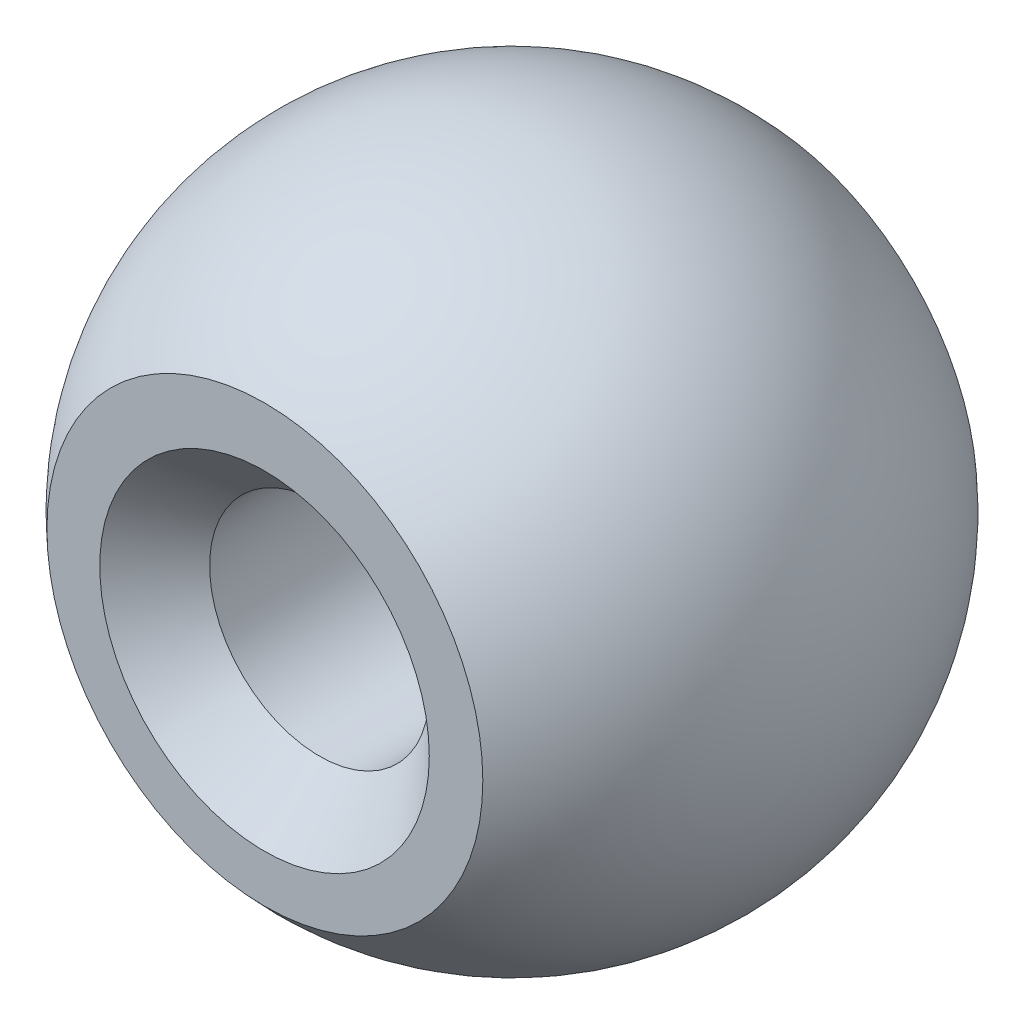
ISO-10303-21;
HEADER;
FILE_DESCRIPTION(('STEP AP214'),'2;1');
FILE_NAME('part.step','',(''),(''),'','','');
FILE_SCHEMA(('AUTOMOTIVE_DESIGN { 1 0 10303 214 1 1 1 1 }'));
ENDSEC;
DATA;
#1=APPLICATION_CONTEXT('core data for automotive mechanical design processes');
#2=APPLICATION_PROTOCOL_DEFINITION('international standard','automotive_design',2000,#1);
#3=PRODUCT_CONTEXT('',#1,'mechanical');
#4=PRODUCT('Part','Part','',(#3));
#5=PRODUCT_RELATED_PRODUCT_CATEGORY('part','',(#4));
#6=PRODUCT_DEFINITION_FORMATION('','',#4);
#7=PRODUCT_DEFINITION_CONTEXT('part definition',#1,'design');
#8=PRODUCT_DEFINITION('design','',#6,#7);
#9=PRODUCT_DEFINITION_SHAPE('','',#8);
#10=(LENGTH_UNIT() NAMED_UNIT(*) SI_UNIT(.MILLI.,.METRE.));
#11=(NAMED_UNIT(*) PLANE_ANGLE_UNIT() SI_UNIT($,.RADIAN.));
#12=(NAMED_UNIT(*) SI_UNIT($,.STERADIAN.) SOLID_ANGLE_UNIT());
#13=UNCERTAINTY_MEASURE_WITH_UNIT(LENGTH_MEASURE(1.E-05),#10,'distance_accuracy_value','');
#14=(GEOMETRIC_REPRESENTATION_CONTEXT(3) GLOBAL_UNCERTAINTY_ASSIGNED_CONTEXT((#13)) GLOBAL_UNIT_ASSIGNED_CONTEXT((#10,
#11,#12)) REPRESENTATION_CONTEXT('',''));
#15=CARTESIAN_POINT('',(0.,0.,0.));
#16=DIRECTION('',(0.,0.,1.));
#17=DIRECTION('',(1.,0.,0.));
#18=AXIS2_PLACEMENT_3D('',#15,#16,#17);
#19=CARTESIAN_POINT('',(0.,0.,4.5));
#20=DIRECTION('',(0.,0.,-1.));
#21=DIRECTION('',(-1.,0.,0.));
#22=AXIS2_PLACEMENT_3D('',#19,#20,#21);
#23=PLANE('',#22);
#24=CARTESIAN_POINT('',(-0.00600624762246791,-0.103314565755938,4.5));
#25=DIRECTION('',(0.,0.,1.));
#26=DIRECTION('',(1.,0.,0.));
#27=AXIS2_PLACEMENT_3D('',#24,#25,#26);
#28=CIRCLE('',#27,3.);
#29=CARTESIAN_POINT('',(2.99399375237753,-0.103314565755938,4.5));
#30=VERTEX_POINT('',#29);
#31=EDGE_CURVE('E54',#30,#30,#28,.T.);
#32=ORIENTED_EDGE('',*,*,#31,.F.);
#33=EDGE_LOOP('',(#32));
#34=FACE_BOUND('',#33,.T.);
#35=CARTESIAN_POINT('',(0.,0.,4.5));
#36=DIRECTION('',(0.,0.,-1.));
#37=DIRECTION('',(-1.,0.,0.));
#38=AXIS2_PLACEMENT_3D('',#35,#36,#37);
#39=CIRCLE('',#38,3.96862696659689);
#40=CARTESIAN_POINT('',(3.96862696659689,0.,4.5));
#41=VERTEX_POINT('',#40);
#42=EDGE_CURVE('E10',#41,#41,#39,.T.);
#43=ORIENTED_EDGE('',*,*,#42,.F.);
#44=EDGE_LOOP('',(#43));
#45=FACE_BOUND('',#44,.T.);
#46=ADVANCED_FACE('F35',(#34,#45),#23,.F.);
#47=CARTESIAN_POINT('',(0.,0.,0.));
#48=DIRECTION('',(0.,0.,-1.));
#49=DIRECTION('',(1.,0.,0.));
#50=AXIS2_PLACEMENT_3D('',#47,#48,#49);
#51=SPHERICAL_SURFACE('',#50,6.);
#52=CARTESIAN_POINT('',(0.,0.,-4.5));
#53=DIRECTION('',(0.,0.,-1.));
#54=DIRECTION('',(-1.,0.,0.));
#55=AXIS2_PLACEMENT_3D('',#52,#53,#54);
#56=CIRCLE('',#55,3.96862696659689);
#57=CARTESIAN_POINT('',(3.96862696659689,0.,-4.5));
#58=VERTEX_POINT('',#57);
#59=EDGE_CURVE('E41',#58,#58,#56,.T.);
#60=CARTESIAN_POINT('',(3.96862696659689,0.,-4.5));
#61=CARTESIAN_POINT('',(4.04813476780701,0.,-4.42988448417367));
#62=CARTESIAN_POINT('',(4.12578044526497,0.,-4.35765791170532));
#63=CARTESIAN_POINT('',(4.27713817883407,0.,-4.20919440386366));
#64=CARTESIAN_POINT('',(4.35085023494521,0.,-4.13295746849034));
#65=CARTESIAN_POINT('',(4.4941313519782,0.,-3.97668498521782));
#66=CARTESIAN_POINT('',(4.56370041290005,0.,-3.89664943731862));
#67=CARTESIAN_POINT('',(4.69850076282096,0.,-3.73300516695228));
#68=CARTESIAN_POINT('',(4.76373205182003,0.,-3.64939644448515));
#69=CARTESIAN_POINT('',(4.8896734716426,0.,-3.47884049038039));
#70=CARTESIAN_POINT('',(4.9503836024661,0.,-3.39189325874275));
#71=CARTESIAN_POINT('',(5.06711223105534,0.,-3.21490454544201));
#72=CARTESIAN_POINT('',(5.12313072882108,0.,-3.1248630637789));
#73=CARTESIAN_POINT('',(5.23031873710099,0.,-2.94193874249415));
#74=CARTESIAN_POINT('',(5.28148824761517,0.,-2.84905590287251));
#75=CARTESIAN_POINT('',(5.37883456206913,0.,-2.66070975397032));
#76=CARTESIAN_POINT('',(5.42501136600891,0.,-2.56524644468976));
#77=CARTESIAN_POINT('',(5.51224256718487,0.,-2.37200748850401));
#78=CARTESIAN_POINT('',(5.55329696442104,0.,-2.27423184159881));
#79=CARTESIAN_POINT('',(5.63016804073458,0.,-2.07664283810176));
#80=CARTESIAN_POINT('',(5.66598471981195,0.,-1.9768294815099));
#81=CARTESIAN_POINT('',(5.73227975951892,0.,-1.77544540970266));
#82=CARTESIAN_POINT('',(5.76275812014852,0.,-1.67387469448727));
#83=CARTESIAN_POINT('',(5.81829091677091,0.,-1.46926119256368));
#84=CARTESIAN_POINT('',(5.8433453527637,0.,-1.36621840585547));
#85=CARTESIAN_POINT('',(5.8879599283703,0.,-1.1589501827416));
#86=CARTESIAN_POINT('',(5.90752006798411,0.,-1.05472474633594));
#87=CARTESIAN_POINT('',(5.94109111122104,0.,-0.845383967399881));
#88=CARTESIAN_POINT('',(5.95510201484416,0.,-0.740268624869487));
#89=CARTESIAN_POINT('',(5.97753523292316,0.,-0.529443276782205));
#90=CARTESIAN_POINT('',(5.98595754737904,0.,-0.423733271225316));
#91=CARTESIAN_POINT('',(5.99718993091746,0.,-0.212015510445618));
#92=CARTESIAN_POINT('',(6.,0.,-0.106007755222809));
#93=CARTESIAN_POINT('',(6.,0.,0.106007755222811));
#94=CARTESIAN_POINT('',(5.99718993091746,0.,0.212015510445621));
#95=CARTESIAN_POINT('',(5.98595754737904,0.,0.423733271225319));
#96=CARTESIAN_POINT('',(5.97753523292316,0.,0.529443276782207));
#97=CARTESIAN_POINT('',(5.95510201484416,0.,0.740268624869489));
#98=CARTESIAN_POINT('',(5.94109111122104,0.,0.845383967399883));
#99=CARTESIAN_POINT('',(5.90752006798411,0.,1.05472474633594));
#100=CARTESIAN_POINT('',(5.8879599283703,0.,1.15895018274161));
#101=CARTESIAN_POINT('',(5.8433453527637,0.,1.36621840585548));
#102=CARTESIAN_POINT('',(5.81829091677091,0.,1.46926119256368));
#103=CARTESIAN_POINT('',(5.76275812014852,0.,1.67387469448727));
#104=CARTESIAN_POINT('',(5.73227975951892,0.,1.77544540970266));
#105=CARTESIAN_POINT('',(5.66598471981195,0.,1.9768294815099));
#106=CARTESIAN_POINT('',(5.63016804073458,0.,2.07664283810176));
#107=CARTESIAN_POINT('',(5.55329696442104,0.,2.27423184159881));
#108=CARTESIAN_POINT('',(5.51224256718486,0.,2.37200748850401));
#109=CARTESIAN_POINT('',(5.42501136600891,0.,2.56524644468976));
#110=CARTESIAN_POINT('',(5.37883456206913,0.,2.66070975397032));
#111=CARTESIAN_POINT('',(5.28148824761517,0.,2.84905590287252));
#112=CARTESIAN_POINT('',(5.23031873710099,0.,2.94193874249415));
#113=CARTESIAN_POINT('',(5.12313072882108,0.,3.1248630637789));
#114=CARTESIAN_POINT('',(5.06711223105534,0.,3.21490454544201));
#115=CARTESIAN_POINT('',(4.9503836024661,0.,3.39189325874276));
#116=CARTESIAN_POINT('',(4.8896734716426,0.,3.47884049038039));
#117=CARTESIAN_POINT('',(4.76373205182003,0.,3.64939644448515));
#118=CARTESIAN_POINT('',(4.69850076282096,0.,3.73300516695229));
#119=CARTESIAN_POINT('',(4.56370041290005,0.,3.89664943731862));
#120=CARTESIAN_POINT('',(4.4941313519782,0.,3.97668498521783));
#121=CARTESIAN_POINT('',(4.35085023494521,0.,4.13295746849034));
#122=CARTESIAN_POINT('',(4.27713817883407,0.,4.20919440386366));
#123=CARTESIAN_POINT('',(4.12578044526497,0.,4.35765791170532));
#124=CARTESIAN_POINT('',(4.04813476780701,0.,4.42988448417367));
#125=CARTESIAN_POINT('',(3.96862696659689,0.,4.5));
#126=B_SPLINE_CURVE_WITH_KNOTS('',3,(#60,#61,#62,#63,#64,#65,#66,#67,#68,#69,#70,#71,#72,#73,
#74,#75,#76,#77,#78,#79,#80,#81,#82,#83,#84,#85,#86,#87,#88,#89,#90,#91,#92,#93,#94,#95,#96,#97,
#98,#99,#100,#101,#102,#103,#104,#105,#106,#107,#108,#109,#110,#111,#112,#113,#114,#115,#116,
#117,#118,#119,#120,#121,#122,#123,#124,#125),.UNSPECIFIED.,.F.,.F.,(4,2,2,2,2,2,2,2,2,2,2,2,2,
2,2,2,2,2,2,2,2,2,2,2,2,2,2,2,2,2,2,2,4),(0.,0.317986053500719,0.635972107001437,
0.953958160502156,1.27194421400287,1.58993026750359,1.90791632100431,2.22590237450503,
2.54388842800575,2.86187448150647,3.17986053500719,3.4978465885079,3.81583264200862,
4.13381869550934,4.45180474901006,4.76979080251078,5.0877768560115,5.40576290951221,
5.72374896301293,6.04173501651365,6.35972107001437,6.67770712351509,6.99569317701581,
7.31367923051652,7.63166528401724,7.94965133751796,8.26763739101868,8.5856234445194,
8.90360949802012,9.22159555152083,9.53958160502155,9.85756765852227,10.175553712023),.UNSPECIFIED.);
#127=EDGE_CURVE('BSEAM62',#58,#41,#126,.T.);
#128=ORIENTED_EDGE('',*,*,#59,.F.);
#129=ORIENTED_EDGE('',*,*,#42,.T.);
#130=ORIENTED_EDGE('',*,*,#127,.T.);
#131=ORIENTED_EDGE('',*,*,#127,.F.);
#132=EDGE_LOOP('',(#128,#130,#129,#131));
#133=FACE_BOUND('',#132,.T.);
#134=ADVANCED_FACE('F62',(#133),#51,.T.);
#135=CARTESIAN_POINT('',(0.,0.,-4.5));
#136=DIRECTION('',(0.,0.,1.));
#137=DIRECTION('',(1.,0.,0.));
#138=AXIS2_PLACEMENT_3D('',#135,#136,#137);
#139=PLANE('',#138);
#140=CARTESIAN_POINT('',(-0.00600624762246791,-0.103314565755938,-4.5));
#141=DIRECTION('',(0.,0.,1.));
#142=DIRECTION('',(1.,0.,0.));
#143=AXIS2_PLACEMENT_3D('',#140,#141,#142);
#144=CIRCLE('',#143,2.);
#145=CARTESIAN_POINT('',(1.99399375237753,-0.103314565755938,-4.5));
#146=VERTEX_POINT('',#145);
#147=EDGE_CURVE('E45',#146,#146,#144,.T.);
#148=ORIENTED_EDGE('',*,*,#147,.T.);
#149=EDGE_LOOP('',(#148));
#150=FACE_BOUND('',#149,.T.);
#151=ORIENTED_EDGE('',*,*,#59,.T.);
#152=EDGE_LOOP('',(#151));
#153=FACE_BOUND('',#152,.T.);
#154=ADVANCED_FACE('F66',(#150,#153),#139,.F.);
#155=CARTESIAN_POINT('',(-0.00600624762246791,-0.103314565755938,4.5));
#156=DIRECTION('',(0.,0.,1.));
#157=DIRECTION('',(1.,0.,0.));
#158=AXIS2_PLACEMENT_3D('',#155,#156,#157);
#159=CYLINDRICAL_SURFACE('',#158,1.99999999999999);
#160=ORIENTED_EDGE('',*,*,#147,.F.);
#161=EDGE_LOOP('',(#160));
#162=FACE_BOUND('',#161,.T.);
#163=CARTESIAN_POINT('',(-0.00600624762246791,-0.103314565755938,3.49999999999998));
#164=DIRECTION('',(0.,0.,1.));
#165=DIRECTION('',(1.,0.,0.));
#166=AXIS2_PLACEMENT_3D('',#163,#164,#165);
#167=CIRCLE('',#166,1.99999999999999);
#168=CARTESIAN_POINT('',(1.99399375237752,-0.103314565755938,3.49999999999998));
#169=VERTEX_POINT('',#168);
#170=EDGE_CURVE('E49',#169,#169,#167,.T.);
#171=ORIENTED_EDGE('',*,*,#170,.T.);
#172=EDGE_LOOP('',(#171));
#173=FACE_BOUND('',#172,.T.);
#174=ADVANCED_FACE('F71',(#162,#173),#159,.F.);
#175=CARTESIAN_POINT('',(-0.00600624762246791,-0.103314565755938,4.5));
#176=DIRECTION('',(0.,0.,1.));
#177=DIRECTION('',(1.,0.,0.));
#178=AXIS2_PLACEMENT_3D('',#175,#176,#177);
#179=CONICAL_SURFACE('',#178,3.,0.785398163397446);
#180=ORIENTED_EDGE('',*,*,#170,.F.);
#181=EDGE_LOOP('',(#180));
#182=FACE_BOUND('',#181,.T.);
#183=ORIENTED_EDGE('',*,*,#31,.T.);
#184=EDGE_LOOP('',(#183));
#185=FACE_BOUND('',#184,.T.);
#186=ADVANCED_FACE('F58',(#182,#185),#179,.F.);
#187=CLOSED_SHELL('',(#46,#134,#154,#174,#186));
#188=MANIFOLD_SOLID_BREP('B2',#187);
#189=ADVANCED_BREP_SHAPE_REPRESENTATION('',(#18,#188),#14);
#190=SHAPE_DEFINITION_REPRESENTATION(#9,#189);
ENDSEC;
END-ISO-10303-21;
